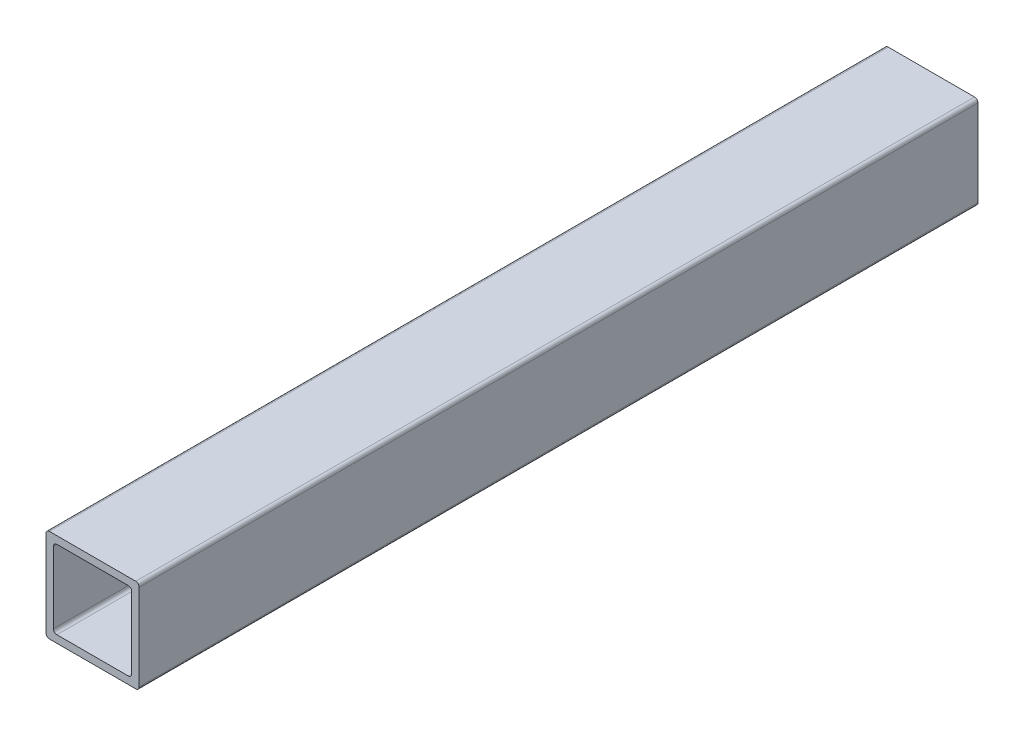
ISO-10303-21;
HEADER;
FILE_DESCRIPTION(('STEP AP214'),'2;1');
FILE_NAME('part.step','',(''),(''),'','','');
FILE_SCHEMA(('AUTOMOTIVE_DESIGN { 1 0 10303 214 1 1 1 1 }'));
ENDSEC;
DATA;
#1=APPLICATION_CONTEXT('core data for automotive mechanical design processes');
#2=APPLICATION_PROTOCOL_DEFINITION('international standard','automotive_design',2000,#1);
#3=PRODUCT_CONTEXT('',#1,'mechanical');
#4=PRODUCT('Part','Part','',(#3));
#5=PRODUCT_RELATED_PRODUCT_CATEGORY('part','',(#4));
#6=PRODUCT_DEFINITION_FORMATION('','',#4);
#7=PRODUCT_DEFINITION_CONTEXT('part definition',#1,'design');
#8=PRODUCT_DEFINITION('design','',#6,#7);
#9=PRODUCT_DEFINITION_SHAPE('','',#8);
#10=(LENGTH_UNIT() NAMED_UNIT(*) SI_UNIT(.MILLI.,.METRE.));
#11=(NAMED_UNIT(*) PLANE_ANGLE_UNIT() SI_UNIT($,.RADIAN.));
#12=(NAMED_UNIT(*) SI_UNIT($,.STERADIAN.) SOLID_ANGLE_UNIT());
#13=UNCERTAINTY_MEASURE_WITH_UNIT(LENGTH_MEASURE(1.E-05),#10,'distance_accuracy_value','');
#14=(GEOMETRIC_REPRESENTATION_CONTEXT(3) GLOBAL_UNCERTAINTY_ASSIGNED_CONTEXT((#13)) GLOBAL_UNIT_ASSIGNED_CONTEXT((#10,
#11,#12)) REPRESENTATION_CONTEXT('',''));
#15=CARTESIAN_POINT('',(0.,0.,0.));
#16=DIRECTION('',(0.,0.,1.));
#17=DIRECTION('',(1.,0.,0.));
#18=AXIS2_PLACEMENT_3D('',#15,#16,#17);
#19=CARTESIAN_POINT('',(23.153,23.153,450.));
#20=DIRECTION('',(0.,0.,-1.));
#21=DIRECTION('',(-1.,0.,0.));
#22=AXIS2_PLACEMENT_3D('',#19,#20,#21);
#23=PLANE('',#22);
#24=CARTESIAN_POINT('',(23.153,23.153,450.));
#25=DIRECTION('',(0.,0.,1.));
#26=DIRECTION('',(-1.,0.,0.));
#27=AXIS2_PLACEMENT_3D('',#24,#25,#26);
#28=CIRCLE('',#27,1.847);
#29=CARTESIAN_POINT('',(25.,23.153,450.));
#30=VERTEX_POINT('',#29);
#31=CARTESIAN_POINT('',(23.153,25.,450.));
#32=VERTEX_POINT('',#31);
#33=EDGE_CURVE('E195',#30,#32,#28,.T.);
#34=ORIENTED_EDGE('',*,*,#33,.T.);
#35=DIRECTION('',(-1.,0.,0.));
#36=VECTOR('',#35,1.);
#37=CARTESIAN_POINT('',(-23.153,25.,450.));
#38=LINE('',#37,#36);
#39=CARTESIAN_POINT('',(-23.153,25.,450.));
#40=VERTEX_POINT('',#39);
#41=EDGE_CURVE('E198',#32,#40,#38,.T.);
#42=ORIENTED_EDGE('',*,*,#41,.T.);
#43=CARTESIAN_POINT('',(-23.153,23.153,450.));
#44=DIRECTION('',(0.,0.,1.));
#45=DIRECTION('',(1.,0.,0.));
#46=AXIS2_PLACEMENT_3D('',#43,#44,#45);
#47=CIRCLE('',#46,1.847);
#48=CARTESIAN_POINT('',(-25.,23.153,450.));
#49=VERTEX_POINT('',#48);
#50=EDGE_CURVE('E201',#40,#49,#47,.T.);
#51=ORIENTED_EDGE('',*,*,#50,.T.);
#52=DIRECTION('',(0.,-1.,0.));
#53=VECTOR('',#52,1.);
#54=CARTESIAN_POINT('',(-25.,23.153,450.));
#55=LINE('',#54,#53);
#56=CARTESIAN_POINT('',(-25.,-23.153,450.));
#57=VERTEX_POINT('',#56);
#58=EDGE_CURVE('E203',#49,#57,#55,.T.);
#59=ORIENTED_EDGE('',*,*,#58,.T.);
#60=CARTESIAN_POINT('',(-23.153,-23.153,450.));
#61=DIRECTION('',(0.,0.,1.));
#62=DIRECTION('',(1.,0.,0.));
#63=AXIS2_PLACEMENT_3D('',#60,#61,#62);
#64=CIRCLE('',#63,1.847);
#65=CARTESIAN_POINT('',(-23.153,-25.,450.));
#66=VERTEX_POINT('',#65);
#67=EDGE_CURVE('E205',#57,#66,#64,.T.);
#68=ORIENTED_EDGE('',*,*,#67,.T.);
#69=DIRECTION('',(1.,0.,0.));
#70=VECTOR('',#69,1.);
#71=CARTESIAN_POINT('',(-23.153,-25.,450.));
#72=LINE('',#71,#70);
#73=CARTESIAN_POINT('',(23.153,-25.,450.));
#74=VERTEX_POINT('',#73);
#75=EDGE_CURVE('E207',#66,#74,#72,.T.);
#76=ORIENTED_EDGE('',*,*,#75,.T.);
#77=CARTESIAN_POINT('',(23.153,-23.153,450.));
#78=DIRECTION('',(0.,0.,1.));
#79=DIRECTION('',(1.,0.,0.));
#80=AXIS2_PLACEMENT_3D('',#77,#78,#79);
#81=CIRCLE('',#80,1.847);
#82=CARTESIAN_POINT('',(25.,-23.153,450.));
#83=VERTEX_POINT('',#82);
#84=EDGE_CURVE('E209',#74,#83,#81,.T.);
#85=ORIENTED_EDGE('',*,*,#84,.T.);
#86=DIRECTION('',(0.,1.,0.));
#87=VECTOR('',#86,1.);
#88=CARTESIAN_POINT('',(25.,23.153,450.));
#89=LINE('',#88,#87);
#90=EDGE_CURVE('E211',#83,#30,#89,.T.);
#91=ORIENTED_EDGE('',*,*,#90,.T.);
#92=EDGE_LOOP('',(#34,#42,#51,#59,#68,#76,#85,#91));
#93=FACE_BOUND('',#92,.T.);
#94=CARTESIAN_POINT('',(19.153,-19.153,450.));
#95=DIRECTION('',(0.,0.,1.));
#96=DIRECTION('',(1.,0.,0.));
#97=AXIS2_PLACEMENT_3D('',#94,#95,#96);
#98=CIRCLE('',#97,1.847);
#99=CARTESIAN_POINT('',(19.153,-21.,450.));
#100=VERTEX_POINT('',#99);
#101=CARTESIAN_POINT('',(21.,-19.153,450.));
#102=VERTEX_POINT('',#101);
#103=EDGE_CURVE('E130',#100,#102,#98,.T.);
#104=ORIENTED_EDGE('',*,*,#103,.F.);
#105=DIRECTION('',(1.,0.,0.));
#106=VECTOR('',#105,1.);
#107=CARTESIAN_POINT('',(-19.153,-21.,450.));
#108=LINE('',#107,#106);
#109=CARTESIAN_POINT('',(-19.153,-21.,450.));
#110=VERTEX_POINT('',#109);
#111=EDGE_CURVE('E163',#110,#100,#108,.T.);
#112=ORIENTED_EDGE('',*,*,#111,.F.);
#113=CARTESIAN_POINT('',(-19.153,-19.153,450.));
#114=DIRECTION('',(0.,0.,1.));
#115=DIRECTION('',(1.,0.,0.));
#116=AXIS2_PLACEMENT_3D('',#113,#114,#115);
#117=CIRCLE('',#116,1.847);
#118=CARTESIAN_POINT('',(-21.,-19.153,450.));
#119=VERTEX_POINT('',#118);
#120=EDGE_CURVE('E161',#119,#110,#117,.T.);
#121=ORIENTED_EDGE('',*,*,#120,.F.);
#122=DIRECTION('',(0.,-1.,0.));
#123=VECTOR('',#122,1.);
#124=CARTESIAN_POINT('',(-21.,19.153,450.));
#125=LINE('',#124,#123);
#126=CARTESIAN_POINT('',(-21.,19.153,450.));
#127=VERTEX_POINT('',#126);
#128=EDGE_CURVE('E159',#127,#119,#125,.T.);
#129=ORIENTED_EDGE('',*,*,#128,.F.);
#130=CARTESIAN_POINT('',(-19.153,19.153,450.));
#131=DIRECTION('',(0.,0.,1.));
#132=DIRECTION('',(1.,0.,0.));
#133=AXIS2_PLACEMENT_3D('',#130,#131,#132);
#134=CIRCLE('',#133,1.847);
#135=CARTESIAN_POINT('',(-19.153,21.,450.));
#136=VERTEX_POINT('',#135);
#137=EDGE_CURVE('E157',#136,#127,#134,.T.);
#138=ORIENTED_EDGE('',*,*,#137,.F.);
#139=DIRECTION('',(-1.,0.,0.));
#140=VECTOR('',#139,1.);
#141=CARTESIAN_POINT('',(-19.153,21.,450.));
#142=LINE('',#141,#140);
#143=CARTESIAN_POINT('',(19.153,21.,450.));
#144=VERTEX_POINT('',#143);
#145=EDGE_CURVE('E153',#144,#136,#142,.T.);
#146=ORIENTED_EDGE('',*,*,#145,.F.);
#147=CARTESIAN_POINT('',(19.153,19.153,450.));
#148=DIRECTION('',(0.,0.,1.));
#149=DIRECTION('',(-1.,0.,0.));
#150=AXIS2_PLACEMENT_3D('',#147,#148,#149);
#151=CIRCLE('',#150,1.847);
#152=CARTESIAN_POINT('',(21.,19.153,450.));
#153=VERTEX_POINT('',#152);
#154=EDGE_CURVE('E151',#153,#144,#151,.T.);
#155=ORIENTED_EDGE('',*,*,#154,.F.);
#156=DIRECTION('',(0.,1.,0.));
#157=VECTOR('',#156,1.);
#158=CARTESIAN_POINT('',(21.,19.153,450.));
#159=LINE('',#158,#157);
#160=EDGE_CURVE('E138',#102,#153,#159,.T.);
#161=ORIENTED_EDGE('',*,*,#160,.F.);
#162=EDGE_LOOP('',(#104,#112,#121,#129,#138,#146,#155,#161));
#163=FACE_BOUND('',#162,.T.);
#164=ADVANCED_FACE('F17',(#93,#163),#23,.F.);
#165=CARTESIAN_POINT('',(23.153,23.153,0.));
#166=DIRECTION('',(0.,0.,-1.));
#167=DIRECTION('',(-1.,0.,0.));
#168=AXIS2_PLACEMENT_3D('',#165,#166,#167);
#169=PLANE('',#168);
#170=CARTESIAN_POINT('',(23.153,23.153,0.));
#171=DIRECTION('',(0.,0.,1.));
#172=DIRECTION('',(-1.,0.,0.));
#173=AXIS2_PLACEMENT_3D('',#170,#171,#172);
#174=CIRCLE('',#173,1.847);
#175=CARTESIAN_POINT('',(25.,23.153,0.));
#176=VERTEX_POINT('',#175);
#177=CARTESIAN_POINT('',(23.153,25.,0.));
#178=VERTEX_POINT('',#177);
#179=EDGE_CURVE('E146',#176,#178,#174,.T.);
#180=ORIENTED_EDGE('',*,*,#179,.F.);
#181=DIRECTION('',(0.,1.,0.));
#182=VECTOR('',#181,1.);
#183=CARTESIAN_POINT('',(25.,23.153,0.));
#184=LINE('',#183,#182);
#185=CARTESIAN_POINT('',(25.,-23.153,0.));
#186=VERTEX_POINT('',#185);
#187=EDGE_CURVE('E199',#186,#176,#184,.T.);
#188=ORIENTED_EDGE('',*,*,#187,.F.);
#189=CARTESIAN_POINT('',(23.153,-23.153,0.));
#190=DIRECTION('',(0.,0.,1.));
#191=DIRECTION('',(1.,0.,0.));
#192=AXIS2_PLACEMENT_3D('',#189,#190,#191);
#193=CIRCLE('',#192,1.847);
#194=CARTESIAN_POINT('',(23.153,-25.,0.));
#195=VERTEX_POINT('',#194);
#196=EDGE_CURVE('E226',#195,#186,#193,.T.);
#197=ORIENTED_EDGE('',*,*,#196,.F.);
#198=DIRECTION('',(1.,0.,0.));
#199=VECTOR('',#198,1.);
#200=CARTESIAN_POINT('',(-23.153,-25.,0.));
#201=LINE('',#200,#199);
#202=CARTESIAN_POINT('',(-23.153,-25.,0.));
#203=VERTEX_POINT('',#202);
#204=EDGE_CURVE('E224',#203,#195,#201,.T.);
#205=ORIENTED_EDGE('',*,*,#204,.F.);
#206=CARTESIAN_POINT('',(-23.153,-23.153,0.));
#207=DIRECTION('',(0.,0.,1.));
#208=DIRECTION('',(1.,0.,0.));
#209=AXIS2_PLACEMENT_3D('',#206,#207,#208);
#210=CIRCLE('',#209,1.847);
#211=CARTESIAN_POINT('',(-25.,-23.153,0.));
#212=VERTEX_POINT('',#211);
#213=EDGE_CURVE('E222',#212,#203,#210,.T.);
#214=ORIENTED_EDGE('',*,*,#213,.F.);
#215=DIRECTION('',(0.,-1.,0.));
#216=VECTOR('',#215,1.);
#217=CARTESIAN_POINT('',(-25.,23.153,0.));
#218=LINE('',#217,#216);
#219=CARTESIAN_POINT('',(-25.,23.153,0.));
#220=VERTEX_POINT('',#219);
#221=EDGE_CURVE('E220',#220,#212,#218,.T.);
#222=ORIENTED_EDGE('',*,*,#221,.F.);
#223=CARTESIAN_POINT('',(-23.153,23.153,0.));
#224=DIRECTION('',(0.,0.,1.));
#225=DIRECTION('',(1.,0.,0.));
#226=AXIS2_PLACEMENT_3D('',#223,#224,#225);
#227=CIRCLE('',#226,1.847);
#228=CARTESIAN_POINT('',(-23.153,25.,0.));
#229=VERTEX_POINT('',#228);
#230=EDGE_CURVE('E218',#229,#220,#227,.T.);
#231=ORIENTED_EDGE('',*,*,#230,.F.);
#232=DIRECTION('',(-1.,0.,0.));
#233=VECTOR('',#232,1.);
#234=CARTESIAN_POINT('',(-23.153,25.,0.));
#235=LINE('',#234,#233);
#236=EDGE_CURVE('E216',#178,#229,#235,.T.);
#237=ORIENTED_EDGE('',*,*,#236,.F.);
#238=EDGE_LOOP('',(#180,#188,#197,#205,#214,#222,#231,#237));
#239=FACE_BOUND('',#238,.T.);
#240=DIRECTION('',(1.,0.,0.));
#241=VECTOR('',#240,1.);
#242=CARTESIAN_POINT('',(-19.153,-21.,0.));
#243=LINE('',#242,#241);
#244=CARTESIAN_POINT('',(-19.153,-21.,0.));
#245=VERTEX_POINT('',#244);
#246=CARTESIAN_POINT('',(19.153,-21.,0.));
#247=VERTEX_POINT('',#246);
#248=EDGE_CURVE('E139',#245,#247,#243,.T.);
#249=ORIENTED_EDGE('',*,*,#248,.T.);
#250=CARTESIAN_POINT('',(19.153,-19.153,0.));
#251=DIRECTION('',(0.,0.,1.));
#252=DIRECTION('',(1.,0.,0.));
#253=AXIS2_PLACEMENT_3D('',#250,#251,#252);
#254=CIRCLE('',#253,1.847);
#255=CARTESIAN_POINT('',(21.,-19.153,0.));
#256=VERTEX_POINT('',#255);
#257=EDGE_CURVE('E40',#247,#256,#254,.T.);
#258=ORIENTED_EDGE('',*,*,#257,.T.);
#259=DIRECTION('',(0.,1.,0.));
#260=VECTOR('',#259,1.);
#261=CARTESIAN_POINT('',(21.,19.153,0.));
#262=LINE('',#261,#260);
#263=CARTESIAN_POINT('',(21.,19.153,0.));
#264=VERTEX_POINT('',#263);
#265=EDGE_CURVE('E145',#256,#264,#262,.T.);
#266=ORIENTED_EDGE('',*,*,#265,.T.);
#267=CARTESIAN_POINT('',(19.153,19.153,0.));
#268=DIRECTION('',(0.,0.,1.));
#269=DIRECTION('',(-1.,0.,0.));
#270=AXIS2_PLACEMENT_3D('',#267,#268,#269);
#271=CIRCLE('',#270,1.847);
#272=CARTESIAN_POINT('',(19.153,21.,0.));
#273=VERTEX_POINT('',#272);
#274=EDGE_CURVE('E167',#264,#273,#271,.T.);
#275=ORIENTED_EDGE('',*,*,#274,.T.);
#276=DIRECTION('',(-1.,0.,0.));
#277=VECTOR('',#276,1.);
#278=CARTESIAN_POINT('',(-19.153,21.,0.));
#279=LINE('',#278,#277);
#280=CARTESIAN_POINT('',(-19.153,21.,0.));
#281=VERTEX_POINT('',#280);
#282=EDGE_CURVE('E170',#273,#281,#279,.T.);
#283=ORIENTED_EDGE('',*,*,#282,.T.);
#284=CARTESIAN_POINT('',(-19.153,19.153,0.));
#285=DIRECTION('',(0.,0.,1.));
#286=DIRECTION('',(1.,0.,0.));
#287=AXIS2_PLACEMENT_3D('',#284,#285,#286);
#288=CIRCLE('',#287,1.847);
#289=CARTESIAN_POINT('',(-21.,19.153,0.));
#290=VERTEX_POINT('',#289);
#291=EDGE_CURVE('E173',#281,#290,#288,.T.);
#292=ORIENTED_EDGE('',*,*,#291,.T.);
#293=DIRECTION('',(0.,-1.,0.));
#294=VECTOR('',#293,1.);
#295=CARTESIAN_POINT('',(-21.,19.153,0.));
#296=LINE('',#295,#294);
#297=CARTESIAN_POINT('',(-21.,-19.153,0.));
#298=VERTEX_POINT('',#297);
#299=EDGE_CURVE('E176',#290,#298,#296,.T.);
#300=ORIENTED_EDGE('',*,*,#299,.T.);
#301=CARTESIAN_POINT('',(-19.153,-19.153,0.));
#302=DIRECTION('',(0.,0.,1.));
#303=DIRECTION('',(1.,0.,0.));
#304=AXIS2_PLACEMENT_3D('',#301,#302,#303);
#305=CIRCLE('',#304,1.847);
#306=EDGE_CURVE('E179',#298,#245,#305,.T.);
#307=ORIENTED_EDGE('',*,*,#306,.T.);
#308=EDGE_LOOP('',(#249,#258,#266,#275,#283,#292,#300,#307));
#309=FACE_BOUND('',#308,.T.);
#310=ADVANCED_FACE('F256',(#239,#309),#169,.T.);
#311=CARTESIAN_POINT('',(23.153,23.153,450.));
#312=DIRECTION('',(0.,0.,-1.));
#313=DIRECTION('',(-1.,0.,0.));
#314=AXIS2_PLACEMENT_3D('',#311,#312,#313);
#315=CYLINDRICAL_SURFACE('',#314,1.847);
#316=ORIENTED_EDGE('',*,*,#179,.T.);
#317=DIRECTION('',(0.,0.,-1.));
#318=VECTOR('',#317,1.);
#319=CARTESIAN_POINT('',(23.153,25.,450.));
#320=LINE('',#319,#318);
#321=EDGE_CURVE('E11',#32,#178,#320,.T.);
#322=ORIENTED_EDGE('',*,*,#321,.F.);
#323=ORIENTED_EDGE('',*,*,#33,.F.);
#324=DIRECTION('',(0.,0.,-1.));
#325=VECTOR('',#324,1.);
#326=CARTESIAN_POINT('',(25.,23.153,450.));
#327=LINE('',#326,#325);
#328=EDGE_CURVE('E213',#30,#176,#327,.T.);
#329=ORIENTED_EDGE('',*,*,#328,.T.);
#330=EDGE_LOOP('',(#316,#322,#323,#329));
#331=FACE_BOUND('',#330,.T.);
#332=ADVANCED_FACE('F19',(#331),#315,.T.);
#333=CARTESIAN_POINT('',(-23.153,25.,450.));
#334=DIRECTION('',(0.,-1.,0.));
#335=DIRECTION('',(0.,0.,-1.));
#336=AXIS2_PLACEMENT_3D('',#333,#334,#335);
#337=PLANE('',#336);
#338=ORIENTED_EDGE('',*,*,#236,.T.);
#339=DIRECTION('',(0.,0.,-1.));
#340=VECTOR('',#339,1.);
#341=CARTESIAN_POINT('',(-23.153,25.,450.));
#342=LINE('',#341,#340);
#343=EDGE_CURVE('E25',#40,#229,#342,.T.);
#344=ORIENTED_EDGE('',*,*,#343,.F.);
#345=ORIENTED_EDGE('',*,*,#41,.F.);
#346=ORIENTED_EDGE('',*,*,#321,.T.);
#347=EDGE_LOOP('',(#338,#344,#345,#346));
#348=FACE_BOUND('',#347,.T.);
#349=ADVANCED_FACE('F273',(#348),#337,.F.);
#350=CARTESIAN_POINT('',(-23.153,23.153,450.));
#351=DIRECTION('',(0.,0.,-1.));
#352=DIRECTION('',(-1.,0.,0.));
#353=AXIS2_PLACEMENT_3D('',#350,#351,#352);
#354=CYLINDRICAL_SURFACE('',#353,1.847);
#355=ORIENTED_EDGE('',*,*,#230,.T.);
#356=DIRECTION('',(0.,0.,-1.));
#357=VECTOR('',#356,1.);
#358=CARTESIAN_POINT('',(-25.,23.153,450.));
#359=LINE('',#358,#357);
#360=EDGE_CURVE('E243',#49,#220,#359,.T.);
#361=ORIENTED_EDGE('',*,*,#360,.F.);
#362=ORIENTED_EDGE('',*,*,#50,.F.);
#363=ORIENTED_EDGE('',*,*,#343,.T.);
#364=EDGE_LOOP('',(#355,#361,#362,#363));
#365=FACE_BOUND('',#364,.T.);
#366=ADVANCED_FACE('F250',(#365),#354,.T.);
#367=CARTESIAN_POINT('',(-25.,23.153,450.));
#368=DIRECTION('',(1.,0.,0.));
#369=DIRECTION('',(0.,0.,-1.));
#370=AXIS2_PLACEMENT_3D('',#367,#368,#369);
#371=PLANE('',#370);
#372=ORIENTED_EDGE('',*,*,#221,.T.);
#373=DIRECTION('',(0.,0.,-1.));
#374=VECTOR('',#373,1.);
#375=CARTESIAN_POINT('',(-25.,-23.153,450.));
#376=LINE('',#375,#374);
#377=EDGE_CURVE('E240',#57,#212,#376,.T.);
#378=ORIENTED_EDGE('',*,*,#377,.F.);
#379=ORIENTED_EDGE('',*,*,#58,.F.);
#380=ORIENTED_EDGE('',*,*,#360,.T.);
#381=EDGE_LOOP('',(#372,#378,#379,#380));
#382=FACE_BOUND('',#381,.T.);
#383=ADVANCED_FACE('F262',(#382),#371,.F.);
#384=CARTESIAN_POINT('',(-23.153,-23.153,450.));
#385=DIRECTION('',(0.,0.,-1.));
#386=DIRECTION('',(-1.,0.,0.));
#387=AXIS2_PLACEMENT_3D('',#384,#385,#386);
#388=CYLINDRICAL_SURFACE('',#387,1.847);
#389=ORIENTED_EDGE('',*,*,#213,.T.);
#390=DIRECTION('',(0.,0.,-1.));
#391=VECTOR('',#390,1.);
#392=CARTESIAN_POINT('',(-23.153,-25.,450.));
#393=LINE('',#392,#391);
#394=EDGE_CURVE('E237',#66,#203,#393,.T.);
#395=ORIENTED_EDGE('',*,*,#394,.F.);
#396=ORIENTED_EDGE('',*,*,#67,.F.);
#397=ORIENTED_EDGE('',*,*,#377,.T.);
#398=EDGE_LOOP('',(#389,#395,#396,#397));
#399=FACE_BOUND('',#398,.T.);
#400=ADVANCED_FACE('F266',(#399),#388,.T.);
#401=CARTESIAN_POINT('',(-23.153,-25.,450.));
#402=DIRECTION('',(0.,1.,0.));
#403=DIRECTION('',(0.,0.,1.));
#404=AXIS2_PLACEMENT_3D('',#401,#402,#403);
#405=PLANE('',#404);
#406=ORIENTED_EDGE('',*,*,#204,.T.);
#407=DIRECTION('',(0.,0.,-1.));
#408=VECTOR('',#407,1.);
#409=CARTESIAN_POINT('',(23.153,-25.,450.));
#410=LINE('',#409,#408);
#411=EDGE_CURVE('E234',#74,#195,#410,.T.);
#412=ORIENTED_EDGE('',*,*,#411,.F.);
#413=ORIENTED_EDGE('',*,*,#75,.F.);
#414=ORIENTED_EDGE('',*,*,#394,.T.);
#415=EDGE_LOOP('',(#406,#412,#413,#414));
#416=FACE_BOUND('',#415,.T.);
#417=ADVANCED_FACE('F286',(#416),#405,.F.);
#418=CARTESIAN_POINT('',(23.153,-23.153,450.));
#419=DIRECTION('',(0.,0.,-1.));
#420=DIRECTION('',(-1.,0.,0.));
#421=AXIS2_PLACEMENT_3D('',#418,#419,#420);
#422=CYLINDRICAL_SURFACE('',#421,1.847);
#423=ORIENTED_EDGE('',*,*,#196,.T.);
#424=DIRECTION('',(0.,0.,-1.));
#425=VECTOR('',#424,1.);
#426=CARTESIAN_POINT('',(25.,-23.153,450.));
#427=LINE('',#426,#425);
#428=EDGE_CURVE('E231',#83,#186,#427,.T.);
#429=ORIENTED_EDGE('',*,*,#428,.F.);
#430=ORIENTED_EDGE('',*,*,#84,.F.);
#431=ORIENTED_EDGE('',*,*,#411,.T.);
#432=EDGE_LOOP('',(#423,#429,#430,#431));
#433=FACE_BOUND('',#432,.T.);
#434=ADVANCED_FACE('F284',(#433),#422,.T.);
#435=CARTESIAN_POINT('',(25.,23.153,450.));
#436=DIRECTION('',(-1.,0.,0.));
#437=DIRECTION('',(0.,0.,1.));
#438=AXIS2_PLACEMENT_3D('',#435,#436,#437);
#439=PLANE('',#438);
#440=ORIENTED_EDGE('',*,*,#187,.T.);
#441=ORIENTED_EDGE('',*,*,#328,.F.);
#442=ORIENTED_EDGE('',*,*,#90,.F.);
#443=ORIENTED_EDGE('',*,*,#428,.T.);
#444=EDGE_LOOP('',(#440,#441,#442,#443));
#445=FACE_BOUND('',#444,.T.);
#446=ADVANCED_FACE('F279',(#445),#439,.F.);
#447=CARTESIAN_POINT('',(19.153,-19.153,450.));
#448=DIRECTION('',(0.,0.,-1.));
#449=DIRECTION('',(-1.,0.,0.));
#450=AXIS2_PLACEMENT_3D('',#447,#448,#449);
#451=CYLINDRICAL_SURFACE('',#450,1.847);
#452=ORIENTED_EDGE('',*,*,#257,.F.);
#453=DIRECTION('',(0.,0.,-1.));
#454=VECTOR('',#453,1.);
#455=CARTESIAN_POINT('',(19.153,-21.,450.));
#456=LINE('',#455,#454);
#457=EDGE_CURVE('E134',#100,#247,#456,.T.);
#458=ORIENTED_EDGE('',*,*,#457,.F.);
#459=ORIENTED_EDGE('',*,*,#103,.T.);
#460=DIRECTION('',(0.,0.,-1.));
#461=VECTOR('',#460,1.);
#462=CARTESIAN_POINT('',(21.,-19.153,450.));
#463=LINE('',#462,#461);
#464=EDGE_CURVE('E133',#102,#256,#463,.T.);
#465=ORIENTED_EDGE('',*,*,#464,.T.);
#466=EDGE_LOOP('',(#452,#458,#459,#465));
#467=FACE_BOUND('',#466,.T.);
#468=ADVANCED_FACE('F132',(#467),#451,.F.);
#469=CARTESIAN_POINT('',(21.,19.153,450.));
#470=DIRECTION('',(-1.,0.,0.));
#471=DIRECTION('',(0.,-1.,0.));
#472=AXIS2_PLACEMENT_3D('',#469,#470,#471);
#473=PLANE('',#472);
#474=ORIENTED_EDGE('',*,*,#265,.F.);
#475=ORIENTED_EDGE('',*,*,#464,.F.);
#476=ORIENTED_EDGE('',*,*,#160,.T.);
#477=DIRECTION('',(0.,0.,-1.));
#478=VECTOR('',#477,1.);
#479=CARTESIAN_POINT('',(21.,19.153,450.));
#480=LINE('',#479,#478);
#481=EDGE_CURVE('E147',#153,#264,#480,.T.);
#482=ORIENTED_EDGE('',*,*,#481,.T.);
#483=EDGE_LOOP('',(#474,#475,#476,#482));
#484=FACE_BOUND('',#483,.T.);
#485=ADVANCED_FACE('F142',(#484),#473,.T.);
#486=CARTESIAN_POINT('',(19.153,19.153,450.));
#487=DIRECTION('',(0.,0.,-1.));
#488=DIRECTION('',(-1.,0.,0.));
#489=AXIS2_PLACEMENT_3D('',#486,#487,#488);
#490=CYLINDRICAL_SURFACE('',#489,1.847);
#491=ORIENTED_EDGE('',*,*,#274,.F.);
#492=ORIENTED_EDGE('',*,*,#481,.F.);
#493=ORIENTED_EDGE('',*,*,#154,.T.);
#494=DIRECTION('',(0.,0.,-1.));
#495=VECTOR('',#494,1.);
#496=CARTESIAN_POINT('',(19.153,21.,450.));
#497=LINE('',#496,#495);
#498=EDGE_CURVE('E192',#144,#273,#497,.T.);
#499=ORIENTED_EDGE('',*,*,#498,.T.);
#500=EDGE_LOOP('',(#491,#492,#493,#499));
#501=FACE_BOUND('',#500,.T.);
#502=ADVANCED_FACE('F316',(#501),#490,.F.);
#503=CARTESIAN_POINT('',(-19.153,21.,450.));
#504=DIRECTION('',(0.,-1.,0.));
#505=DIRECTION('',(1.,0.,0.));
#506=AXIS2_PLACEMENT_3D('',#503,#504,#505);
#507=PLANE('',#506);
#508=ORIENTED_EDGE('',*,*,#282,.F.);
#509=ORIENTED_EDGE('',*,*,#498,.F.);
#510=ORIENTED_EDGE('',*,*,#145,.T.);
#511=DIRECTION('',(0.,0.,-1.));
#512=VECTOR('',#511,1.);
#513=CARTESIAN_POINT('',(-19.153,21.,450.));
#514=LINE('',#513,#512);
#515=EDGE_CURVE('E190',#136,#281,#514,.T.);
#516=ORIENTED_EDGE('',*,*,#515,.T.);
#517=EDGE_LOOP('',(#508,#509,#510,#516));
#518=FACE_BOUND('',#517,.T.);
#519=ADVANCED_FACE('F321',(#518),#507,.T.);
#520=CARTESIAN_POINT('',(-19.153,19.153,450.));
#521=DIRECTION('',(0.,0.,-1.));
#522=DIRECTION('',(-1.,0.,0.));
#523=AXIS2_PLACEMENT_3D('',#520,#521,#522);
#524=CYLINDRICAL_SURFACE('',#523,1.847);
#525=ORIENTED_EDGE('',*,*,#291,.F.);
#526=ORIENTED_EDGE('',*,*,#515,.F.);
#527=ORIENTED_EDGE('',*,*,#137,.T.);
#528=DIRECTION('',(0.,0.,-1.));
#529=VECTOR('',#528,1.);
#530=CARTESIAN_POINT('',(-21.,19.153,450.));
#531=LINE('',#530,#529);
#532=EDGE_CURVE('E188',#127,#290,#531,.T.);
#533=ORIENTED_EDGE('',*,*,#532,.T.);
#534=EDGE_LOOP('',(#525,#526,#527,#533));
#535=FACE_BOUND('',#534,.T.);
#536=ADVANCED_FACE('F327',(#535),#524,.F.);
#537=CARTESIAN_POINT('',(-21.,19.153,450.));
#538=DIRECTION('',(1.,0.,0.));
#539=DIRECTION('',(0.,0.,-1.));
#540=AXIS2_PLACEMENT_3D('',#537,#538,#539);
#541=PLANE('',#540);
#542=ORIENTED_EDGE('',*,*,#299,.F.);
#543=ORIENTED_EDGE('',*,*,#532,.F.);
#544=ORIENTED_EDGE('',*,*,#128,.T.);
#545=DIRECTION('',(0.,0.,-1.));
#546=VECTOR('',#545,1.);
#547=CARTESIAN_POINT('',(-21.,-19.153,450.));
#548=LINE('',#547,#546);
#549=EDGE_CURVE('E186',#119,#298,#548,.T.);
#550=ORIENTED_EDGE('',*,*,#549,.T.);
#551=EDGE_LOOP('',(#542,#543,#544,#550));
#552=FACE_BOUND('',#551,.T.);
#553=ADVANCED_FACE('F331',(#552),#541,.T.);
#554=CARTESIAN_POINT('',(-19.153,-19.153,450.));
#555=DIRECTION('',(0.,0.,-1.));
#556=DIRECTION('',(-1.,0.,0.));
#557=AXIS2_PLACEMENT_3D('',#554,#555,#556);
#558=CYLINDRICAL_SURFACE('',#557,1.847);
#559=ORIENTED_EDGE('',*,*,#306,.F.);
#560=ORIENTED_EDGE('',*,*,#549,.F.);
#561=ORIENTED_EDGE('',*,*,#120,.T.);
#562=DIRECTION('',(0.,0.,-1.));
#563=VECTOR('',#562,1.);
#564=CARTESIAN_POINT('',(-19.153,-21.,450.));
#565=LINE('',#564,#563);
#566=EDGE_CURVE('E32',#110,#245,#565,.T.);
#567=ORIENTED_EDGE('',*,*,#566,.T.);
#568=EDGE_LOOP('',(#559,#560,#561,#567));
#569=FACE_BOUND('',#568,.T.);
#570=ADVANCED_FACE('F335',(#569),#558,.F.);
#571=CARTESIAN_POINT('',(-19.153,-21.,450.));
#572=DIRECTION('',(0.,1.,0.));
#573=DIRECTION('',(-1.,0.,0.));
#574=AXIS2_PLACEMENT_3D('',#571,#572,#573);
#575=PLANE('',#574);
#576=ORIENTED_EDGE('',*,*,#248,.F.);
#577=ORIENTED_EDGE('',*,*,#566,.F.);
#578=ORIENTED_EDGE('',*,*,#111,.T.);
#579=ORIENTED_EDGE('',*,*,#457,.T.);
#580=EDGE_LOOP('',(#576,#577,#578,#579));
#581=FACE_BOUND('',#580,.T.);
#582=ADVANCED_FACE('F339',(#581),#575,.T.);
#583=CLOSED_SHELL('',(#164,#310,#332,#349,#366,#383,#400,#417,#434,#446,#468,#485,#502,#519,
#536,#553,#570,#582));
#584=MANIFOLD_SOLID_BREP('B1',#583);
#585=ADVANCED_BREP_SHAPE_REPRESENTATION('',(#18,#584),#14);
#586=SHAPE_DEFINITION_REPRESENTATION(#9,#585);
ENDSEC;
END-ISO-10303-21;
